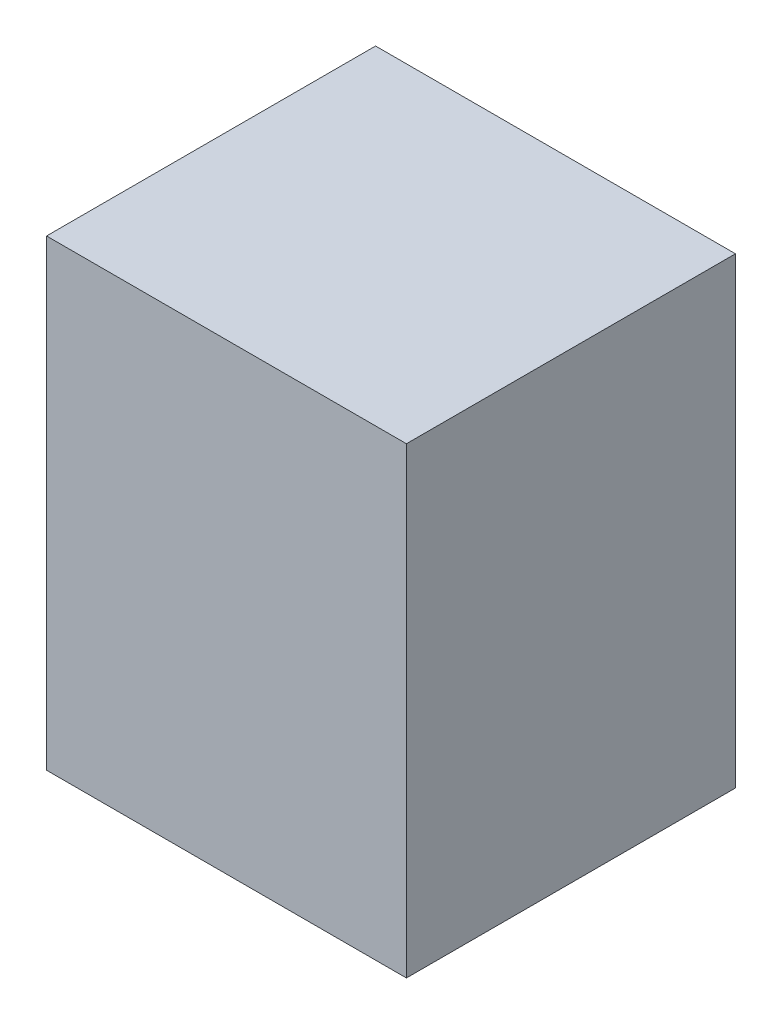
ISO-10303-21;
HEADER;
FILE_DESCRIPTION(('STEP AP214'),'2;1');
FILE_NAME('part.step','',(''),(''),'','','');
FILE_SCHEMA(('AUTOMOTIVE_DESIGN { 1 0 10303 214 1 1 1 1 }'));
ENDSEC;
DATA;
#1=APPLICATION_CONTEXT('core data for automotive mechanical design processes');
#2=APPLICATION_PROTOCOL_DEFINITION('international standard','automotive_design',2000,#1);
#3=PRODUCT_CONTEXT('',#1,'mechanical');
#4=PRODUCT('Part','Part','',(#3));
#5=PRODUCT_RELATED_PRODUCT_CATEGORY('part','',(#4));
#6=PRODUCT_DEFINITION_FORMATION('','',#4);
#7=PRODUCT_DEFINITION_CONTEXT('part definition',#1,'design');
#8=PRODUCT_DEFINITION('design','',#6,#7);
#9=PRODUCT_DEFINITION_SHAPE('','',#8);
#10=(LENGTH_UNIT() NAMED_UNIT(*) SI_UNIT(.MILLI.,.METRE.));
#11=(NAMED_UNIT(*) PLANE_ANGLE_UNIT() SI_UNIT($,.RADIAN.));
#12=(NAMED_UNIT(*) SI_UNIT($,.STERADIAN.) SOLID_ANGLE_UNIT());
#13=UNCERTAINTY_MEASURE_WITH_UNIT(LENGTH_MEASURE(1.E-05),#10,'distance_accuracy_value','');
#14=(GEOMETRIC_REPRESENTATION_CONTEXT(3) GLOBAL_UNCERTAINTY_ASSIGNED_CONTEXT((#13)) GLOBAL_UNIT_ASSIGNED_CONTEXT((#10,
#11,#12)) REPRESENTATION_CONTEXT('',''));
#15=CARTESIAN_POINT('',(0.,0.,0.));
#16=DIRECTION('',(0.,0.,1.));
#17=DIRECTION('',(1.,0.,0.));
#18=AXIS2_PLACEMENT_3D('',#15,#16,#17);
#19=CARTESIAN_POINT('',(-0.87499952,1.12500156,1.59999934));
#20=DIRECTION('',(0.,0.,1.));
#21=DIRECTION('',(1.,0.,0.));
#22=AXIS2_PLACEMENT_3D('',#19,#20,#21);
#23=PLANE('',#22);
#24=DIRECTION('',(0.,1.,0.));
#25=VECTOR('',#24,1.);
#26=CARTESIAN_POINT('',(-0.87499952,-1.12499902,1.59999934));
#27=LINE('',#26,#25);
#28=CARTESIAN_POINT('',(-0.87499952,-1.12499902,1.59999934));
#29=VERTEX_POINT('',#28);
#30=CARTESIAN_POINT('',(-0.87499952,1.12500156,1.59999934));
#31=VERTEX_POINT('',#30);
#32=EDGE_CURVE('E25',#29,#31,#27,.T.);
#33=ORIENTED_EDGE('',*,*,#32,.F.);
#34=DIRECTION('',(-1.,0.,0.));
#35=VECTOR('',#34,1.);
#36=CARTESIAN_POINT('',(0.87500206,-1.12499902,1.59999934));
#37=LINE('',#36,#35);
#38=CARTESIAN_POINT('',(0.87500206,-1.12499902,1.59999934));
#39=VERTEX_POINT('',#38);
#40=EDGE_CURVE('E57',#39,#29,#37,.T.);
#41=ORIENTED_EDGE('',*,*,#40,.F.);
#42=DIRECTION('',(0.,-1.,0.));
#43=VECTOR('',#42,1.);
#44=CARTESIAN_POINT('',(0.87500206,1.12500156,1.59999934));
#45=LINE('',#44,#43);
#46=CARTESIAN_POINT('',(0.87500206,1.12500156,1.59999934));
#47=VERTEX_POINT('',#46);
#48=EDGE_CURVE('E73',#47,#39,#45,.T.);
#49=ORIENTED_EDGE('',*,*,#48,.F.);
#50=DIRECTION('',(1.,0.,0.));
#51=VECTOR('',#50,1.);
#52=CARTESIAN_POINT('',(-0.87499952,1.12500156,1.59999934));
#53=LINE('',#52,#51);
#54=EDGE_CURVE('E97',#31,#47,#53,.T.);
#55=ORIENTED_EDGE('',*,*,#54,.F.);
#56=EDGE_LOOP('',(#33,#41,#49,#55));
#57=FACE_BOUND('',#56,.T.);
#58=ADVANCED_FACE('F17',(#57),#23,.T.);
#59=CARTESIAN_POINT('',(-0.87499952,1.12500156,0.));
#60=DIRECTION('',(0.,0.,1.));
#61=DIRECTION('',(1.,0.,0.));
#62=AXIS2_PLACEMENT_3D('',#59,#60,#61);
#63=PLANE('',#62);
#64=DIRECTION('',(1.,0.,0.));
#65=VECTOR('',#64,1.);
#66=CARTESIAN_POINT('',(-0.87499952,1.12500156,0.));
#67=LINE('',#66,#65);
#68=CARTESIAN_POINT('',(-0.87499952,1.12500156,0.));
#69=VERTEX_POINT('',#68);
#70=CARTESIAN_POINT('',(0.87500206,1.12500156,0.));
#71=VERTEX_POINT('',#70);
#72=EDGE_CURVE('E83',#69,#71,#67,.T.);
#73=ORIENTED_EDGE('',*,*,#72,.T.);
#74=DIRECTION('',(0.,-1.,0.));
#75=VECTOR('',#74,1.);
#76=CARTESIAN_POINT('',(0.87500206,1.12500156,0.));
#77=LINE('',#76,#75);
#78=CARTESIAN_POINT('',(0.87500206,-1.12499902,0.));
#79=VERTEX_POINT('',#78);
#80=EDGE_CURVE('E67',#71,#79,#77,.T.);
#81=ORIENTED_EDGE('',*,*,#80,.T.);
#82=DIRECTION('',(-1.,0.,0.));
#83=VECTOR('',#82,1.);
#84=CARTESIAN_POINT('',(0.87500206,-1.12499902,0.));
#85=LINE('',#84,#83);
#86=CARTESIAN_POINT('',(-0.87499952,-1.12499902,0.));
#87=VERTEX_POINT('',#86);
#88=EDGE_CURVE('E85',#79,#87,#85,.T.);
#89=ORIENTED_EDGE('',*,*,#88,.T.);
#90=DIRECTION('',(0.,1.,0.));
#91=VECTOR('',#90,1.);
#92=CARTESIAN_POINT('',(-0.87499952,-1.12499902,0.));
#93=LINE('',#92,#91);
#94=EDGE_CURVE('E11',#87,#69,#93,.T.);
#95=ORIENTED_EDGE('',*,*,#94,.T.);
#96=EDGE_LOOP('',(#73,#81,#89,#95));
#97=FACE_BOUND('',#96,.T.);
#98=ADVANCED_FACE('F82',(#97),#63,.F.);
#99=CARTESIAN_POINT('',(-0.87499952,-1.12499902,0.));
#100=DIRECTION('',(-1.,0.,0.));
#101=DIRECTION('',(0.,0.,1.));
#102=AXIS2_PLACEMENT_3D('',#99,#100,#101);
#103=PLANE('',#102);
#104=DIRECTION('',(0.,0.,1.));
#105=VECTOR('',#104,1.);
#106=CARTESIAN_POINT('',(-0.87499952,-1.12499902,0.));
#107=LINE('',#106,#105);
#108=EDGE_CURVE('E115',#87,#29,#107,.T.);
#109=ORIENTED_EDGE('',*,*,#108,.T.);
#110=ORIENTED_EDGE('',*,*,#32,.T.);
#111=DIRECTION('',(0.,0.,1.));
#112=VECTOR('',#111,1.);
#113=CARTESIAN_POINT('',(-0.87499952,1.12500156,0.));
#114=LINE('',#113,#112);
#115=EDGE_CURVE('E91',#69,#31,#114,.T.);
#116=ORIENTED_EDGE('',*,*,#115,.F.);
#117=ORIENTED_EDGE('',*,*,#94,.F.);
#118=EDGE_LOOP('',(#109,#110,#116,#117));
#119=FACE_BOUND('',#118,.T.);
#120=ADVANCED_FACE('F95',(#119),#103,.T.);
#121=CARTESIAN_POINT('',(0.87500206,-1.12499902,0.));
#122=DIRECTION('',(0.,-1.,0.));
#123=DIRECTION('',(0.,0.,-1.));
#124=AXIS2_PLACEMENT_3D('',#121,#122,#123);
#125=PLANE('',#124);
#126=DIRECTION('',(0.,0.,1.));
#127=VECTOR('',#126,1.);
#128=CARTESIAN_POINT('',(0.87500206,-1.12499902,0.));
#129=LINE('',#128,#127);
#130=EDGE_CURVE('E105',#79,#39,#129,.T.);
#131=ORIENTED_EDGE('',*,*,#130,.T.);
#132=ORIENTED_EDGE('',*,*,#40,.T.);
#133=ORIENTED_EDGE('',*,*,#108,.F.);
#134=ORIENTED_EDGE('',*,*,#88,.F.);
#135=EDGE_LOOP('',(#131,#132,#133,#134));
#136=FACE_BOUND('',#135,.T.);
#137=ADVANCED_FACE('F159',(#136),#125,.T.);
#138=CARTESIAN_POINT('',(0.87500206,1.12500156,0.));
#139=DIRECTION('',(1.,0.,0.));
#140=DIRECTION('',(0.,1.,0.));
#141=AXIS2_PLACEMENT_3D('',#138,#139,#140);
#142=PLANE('',#141);
#143=DIRECTION('',(0.,0.,1.));
#144=VECTOR('',#143,1.);
#145=CARTESIAN_POINT('',(0.87500206,1.12500156,0.));
#146=LINE('',#145,#144);
#147=EDGE_CURVE('E92',#71,#47,#146,.T.);
#148=ORIENTED_EDGE('',*,*,#147,.T.);
#149=ORIENTED_EDGE('',*,*,#48,.T.);
#150=ORIENTED_EDGE('',*,*,#130,.F.);
#151=ORIENTED_EDGE('',*,*,#80,.F.);
#152=EDGE_LOOP('',(#148,#149,#150,#151));
#153=FACE_BOUND('',#152,.T.);
#154=ADVANCED_FACE('F160',(#153),#142,.T.);
#155=CARTESIAN_POINT('',(-0.87499952,1.12500156,0.));
#156=DIRECTION('',(0.,1.,0.));
#157=DIRECTION('',(1.,0.,0.));
#158=AXIS2_PLACEMENT_3D('',#155,#156,#157);
#159=PLANE('',#158);
#160=ORIENTED_EDGE('',*,*,#115,.T.);
#161=ORIENTED_EDGE('',*,*,#54,.T.);
#162=ORIENTED_EDGE('',*,*,#147,.F.);
#163=ORIENTED_EDGE('',*,*,#72,.F.);
#164=EDGE_LOOP('',(#160,#161,#162,#163));
#165=FACE_BOUND('',#164,.T.);
#166=ADVANCED_FACE('F89',(#165),#159,.T.);
#167=CLOSED_SHELL('',(#58,#98,#120,#137,#154,#166));
#168=MANIFOLD_SOLID_BREP('B1',#167);
#169=ADVANCED_BREP_SHAPE_REPRESENTATION('',(#18,#168),#14);
#170=SHAPE_DEFINITION_REPRESENTATION(#9,#169);
ENDSEC;
END-ISO-10303-21;
